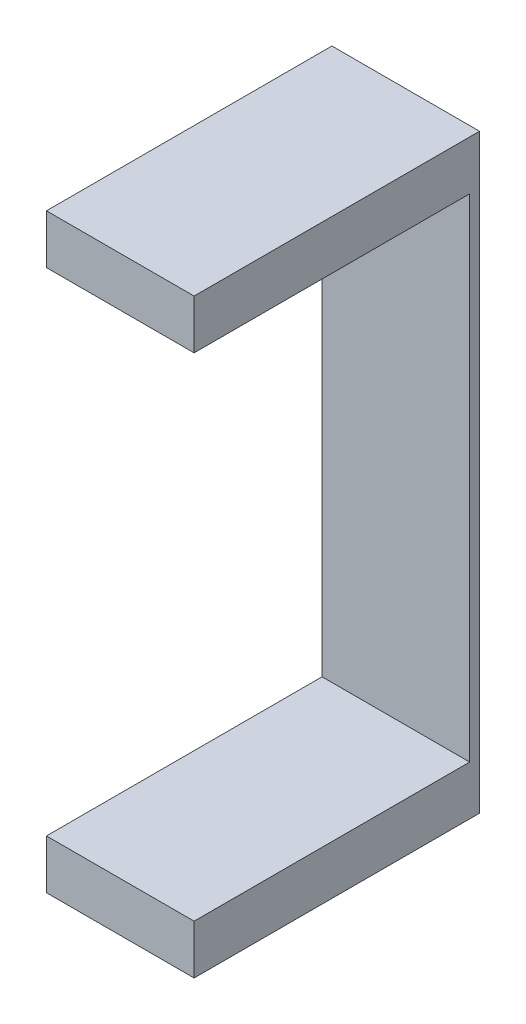
ISO-10303-21;
HEADER;
FILE_DESCRIPTION(('STEP AP214'),'2;1');
FILE_NAME('part.step','',(''),(''),'','','');
FILE_SCHEMA(('AUTOMOTIVE_DESIGN { 1 0 10303 214 1 1 1 1 }'));
ENDSEC;
DATA;
#1=APPLICATION_CONTEXT('core data for automotive mechanical design processes');
#2=APPLICATION_PROTOCOL_DEFINITION('international standard','automotive_design',2000,#1);
#3=PRODUCT_CONTEXT('',#1,'mechanical');
#4=PRODUCT('Part','Part','',(#3));
#5=PRODUCT_RELATED_PRODUCT_CATEGORY('part','',(#4));
#6=PRODUCT_DEFINITION_FORMATION('','',#4);
#7=PRODUCT_DEFINITION_CONTEXT('part definition',#1,'design');
#8=PRODUCT_DEFINITION('design','',#6,#7);
#9=PRODUCT_DEFINITION_SHAPE('','',#8);
#10=(LENGTH_UNIT() NAMED_UNIT(*) SI_UNIT(.MILLI.,.METRE.));
#11=(NAMED_UNIT(*) PLANE_ANGLE_UNIT() SI_UNIT($,.RADIAN.));
#12=(NAMED_UNIT(*) SI_UNIT($,.STERADIAN.) SOLID_ANGLE_UNIT());
#13=UNCERTAINTY_MEASURE_WITH_UNIT(LENGTH_MEASURE(1.E-05),#10,'distance_accuracy_value','');
#14=(GEOMETRIC_REPRESENTATION_CONTEXT(3) GLOBAL_UNCERTAINTY_ASSIGNED_CONTEXT((#13)) GLOBAL_UNIT_ASSIGNED_CONTEXT((#10,
#11,#12)) REPRESENTATION_CONTEXT('',''));
#15=CARTESIAN_POINT('',(0.,0.,0.));
#16=DIRECTION('',(0.,0.,1.));
#17=DIRECTION('',(1.,0.,0.));
#18=AXIS2_PLACEMENT_3D('',#15,#16,#17);
#19=CARTESIAN_POINT('',(-15.,60.,2.));
#20=DIRECTION('',(0.,-1.,0.));
#21=DIRECTION('',(0.,0.,-1.));
#22=AXIS2_PLACEMENT_3D('',#19,#20,#21);
#23=PLANE('',#22);
#24=DIRECTION('',(-1.,0.,0.));
#25=VECTOR('',#24,1.);
#26=CARTESIAN_POINT('',(-15.,60.,0.));
#27=LINE('',#26,#25);
#28=CARTESIAN_POINT('',(15.,60.,0.));
#29=VERTEX_POINT('',#28);
#30=CARTESIAN_POINT('',(-15.,60.,0.));
#31=VERTEX_POINT('',#30);
#32=EDGE_CURVE('E125',#29,#31,#27,.T.);
#33=ORIENTED_EDGE('',*,*,#32,.T.);
#34=DIRECTION('',(0.,0.,-1.));
#35=VECTOR('',#34,1.);
#36=CARTESIAN_POINT('',(-15.,60.,2.));
#37=LINE('',#36,#35);
#38=CARTESIAN_POINT('',(-15.,60.,58.));
#39=VERTEX_POINT('',#38);
#40=EDGE_CURVE('E11',#39,#31,#37,.T.);
#41=ORIENTED_EDGE('',*,*,#40,.F.);
#42=DIRECTION('',(-1.,0.,0.));
#43=VECTOR('',#42,1.);
#44=CARTESIAN_POINT('',(-15.,60.,58.));
#45=LINE('',#44,#43);
#46=CARTESIAN_POINT('',(15.,60.,58.));
#47=VERTEX_POINT('',#46);
#48=EDGE_CURVE('E119',#47,#39,#45,.T.);
#49=ORIENTED_EDGE('',*,*,#48,.F.);
#50=DIRECTION('',(0.,0.,-1.));
#51=VECTOR('',#50,1.);
#52=CARTESIAN_POINT('',(15.,60.,2.));
#53=LINE('',#52,#51);
#54=EDGE_CURVE('E152',#47,#29,#53,.T.);
#55=ORIENTED_EDGE('',*,*,#54,.T.);
#56=EDGE_LOOP('',(#33,#41,#49,#55));
#57=FACE_BOUND('',#56,.T.);
#58=ADVANCED_FACE('F39',(#57),#23,.F.);
#59=CARTESIAN_POINT('',(-15.,-60.,2.));
#60=DIRECTION('',(1.,0.,0.));
#61=DIRECTION('',(0.,0.,-1.));
#62=AXIS2_PLACEMENT_3D('',#59,#60,#61);
#63=PLANE('',#62);
#64=DIRECTION('',(0.,-1.,0.));
#65=VECTOR('',#64,1.);
#66=CARTESIAN_POINT('',(-15.,-60.,0.));
#67=LINE('',#66,#65);
#68=CARTESIAN_POINT('',(-15.,-60.,0.));
#69=VERTEX_POINT('',#68);
#70=EDGE_CURVE('E128',#31,#69,#67,.T.);
#71=ORIENTED_EDGE('',*,*,#70,.T.);
#72=DIRECTION('',(0.,0.,-1.));
#73=VECTOR('',#72,1.);
#74=CARTESIAN_POINT('',(-15.,-60.,2.));
#75=LINE('',#74,#73);
#76=CARTESIAN_POINT('',(-15.,-60.,58.));
#77=VERTEX_POINT('',#76);
#78=EDGE_CURVE('E46',#77,#69,#75,.T.);
#79=ORIENTED_EDGE('',*,*,#78,.F.);
#80=DIRECTION('',(0.,-1.,0.));
#81=VECTOR('',#80,1.);
#82=CARTESIAN_POINT('',(-15.,-60.,58.));
#83=LINE('',#82,#81);
#84=CARTESIAN_POINT('',(-15.,-50.,58.));
#85=VERTEX_POINT('',#84);
#86=EDGE_CURVE('E140',#85,#77,#83,.T.);
#87=ORIENTED_EDGE('',*,*,#86,.F.);
#88=DIRECTION('',(0.,0.,-1.));
#89=VECTOR('',#88,1.);
#90=CARTESIAN_POINT('',(-15.,-50.,58.));
#91=LINE('',#90,#89);
#92=CARTESIAN_POINT('',(-15.,-50.,2.));
#93=VERTEX_POINT('',#92);
#94=EDGE_CURVE('E136',#85,#93,#91,.T.);
#95=ORIENTED_EDGE('',*,*,#94,.T.);
#96=DIRECTION('',(0.,-1.,0.));
#97=VECTOR('',#96,1.);
#98=CARTESIAN_POINT('',(-15.,-60.,2.));
#99=LINE('',#98,#97);
#100=CARTESIAN_POINT('',(-15.,50.,2.));
#101=VERTEX_POINT('',#100);
#102=EDGE_CURVE('E124',#101,#93,#99,.T.);
#103=ORIENTED_EDGE('',*,*,#102,.F.);
#104=DIRECTION('',(0.,0.,-1.));
#105=VECTOR('',#104,1.);
#106=CARTESIAN_POINT('',(-15.,50.,58.));
#107=LINE('',#106,#105);
#108=CARTESIAN_POINT('',(-15.,50.,58.));
#109=VERTEX_POINT('',#108);
#110=EDGE_CURVE('E106',#109,#101,#107,.T.);
#111=ORIENTED_EDGE('',*,*,#110,.F.);
#112=DIRECTION('',(0.,-1.,0.));
#113=VECTOR('',#112,1.);
#114=CARTESIAN_POINT('',(-15.,60.,58.));
#115=LINE('',#114,#113);
#116=EDGE_CURVE('E113',#39,#109,#115,.T.);
#117=ORIENTED_EDGE('',*,*,#116,.F.);
#118=ORIENTED_EDGE('',*,*,#40,.T.);
#119=EDGE_LOOP('',(#71,#79,#87,#95,#103,#111,#117,#118));
#120=FACE_BOUND('',#119,.T.);
#121=ADVANCED_FACE('F122',(#120),#63,.F.);
#122=CARTESIAN_POINT('',(-15.,-60.,2.));
#123=DIRECTION('',(0.,1.,0.));
#124=DIRECTION('',(-1.,0.,0.));
#125=AXIS2_PLACEMENT_3D('',#122,#123,#124);
#126=PLANE('',#125);
#127=DIRECTION('',(1.,0.,0.));
#128=VECTOR('',#127,1.);
#129=CARTESIAN_POINT('',(-15.,-60.,0.));
#130=LINE('',#129,#128);
#131=CARTESIAN_POINT('',(15.,-60.,0.));
#132=VERTEX_POINT('',#131);
#133=EDGE_CURVE('E155',#69,#132,#130,.T.);
#134=ORIENTED_EDGE('',*,*,#133,.T.);
#135=DIRECTION('',(0.,0.,-1.));
#136=VECTOR('',#135,1.);
#137=CARTESIAN_POINT('',(15.,-60.,2.));
#138=LINE('',#137,#136);
#139=CARTESIAN_POINT('',(15.,-60.,58.));
#140=VERTEX_POINT('',#139);
#141=EDGE_CURVE('E160',#140,#132,#138,.T.);
#142=ORIENTED_EDGE('',*,*,#141,.F.);
#143=DIRECTION('',(1.,0.,0.));
#144=VECTOR('',#143,1.);
#145=CARTESIAN_POINT('',(-15.,-60.,58.));
#146=LINE('',#145,#144);
#147=EDGE_CURVE('E144',#77,#140,#146,.T.);
#148=ORIENTED_EDGE('',*,*,#147,.F.);
#149=ORIENTED_EDGE('',*,*,#78,.T.);
#150=EDGE_LOOP('',(#134,#142,#148,#149));
#151=FACE_BOUND('',#150,.T.);
#152=ADVANCED_FACE('F166',(#151),#126,.F.);
#153=CARTESIAN_POINT('',(15.,-60.,2.));
#154=DIRECTION('',(-1.,0.,0.));
#155=DIRECTION('',(0.,0.,1.));
#156=AXIS2_PLACEMENT_3D('',#153,#154,#155);
#157=PLANE('',#156);
#158=DIRECTION('',(0.,1.,0.));
#159=VECTOR('',#158,1.);
#160=CARTESIAN_POINT('',(15.,-60.,0.));
#161=LINE('',#160,#159);
#162=EDGE_CURVE('E151',#132,#29,#161,.T.);
#163=ORIENTED_EDGE('',*,*,#162,.T.);
#164=ORIENTED_EDGE('',*,*,#54,.F.);
#165=DIRECTION('',(0.,1.,0.));
#166=VECTOR('',#165,1.);
#167=CARTESIAN_POINT('',(15.,60.,58.));
#168=LINE('',#167,#166);
#169=CARTESIAN_POINT('',(15.,50.,58.));
#170=VERTEX_POINT('',#169);
#171=EDGE_CURVE('E112',#170,#47,#168,.T.);
#172=ORIENTED_EDGE('',*,*,#171,.F.);
#173=DIRECTION('',(0.,0.,-1.));
#174=VECTOR('',#173,1.);
#175=CARTESIAN_POINT('',(15.,50.,58.));
#176=LINE('',#175,#174);
#177=CARTESIAN_POINT('',(15.,50.,2.));
#178=VERTEX_POINT('',#177);
#179=EDGE_CURVE('E108',#170,#178,#176,.T.);
#180=ORIENTED_EDGE('',*,*,#179,.T.);
#181=DIRECTION('',(0.,1.,0.));
#182=VECTOR('',#181,1.);
#183=CARTESIAN_POINT('',(15.,-60.,2.));
#184=LINE('',#183,#182);
#185=CARTESIAN_POINT('',(15.,-50.,2.));
#186=VERTEX_POINT('',#185);
#187=EDGE_CURVE('E150',#186,#178,#184,.T.);
#188=ORIENTED_EDGE('',*,*,#187,.F.);
#189=DIRECTION('',(0.,0.,-1.));
#190=VECTOR('',#189,1.);
#191=CARTESIAN_POINT('',(15.,-50.,58.));
#192=LINE('',#191,#190);
#193=CARTESIAN_POINT('',(15.,-50.,58.));
#194=VERTEX_POINT('',#193);
#195=EDGE_CURVE('E133',#194,#186,#192,.T.);
#196=ORIENTED_EDGE('',*,*,#195,.F.);
#197=DIRECTION('',(0.,1.,0.));
#198=VECTOR('',#197,1.);
#199=CARTESIAN_POINT('',(15.,-60.,58.));
#200=LINE('',#199,#198);
#201=EDGE_CURVE('E142',#140,#194,#200,.T.);
#202=ORIENTED_EDGE('',*,*,#201,.F.);
#203=ORIENTED_EDGE('',*,*,#141,.T.);
#204=EDGE_LOOP('',(#163,#164,#172,#180,#188,#196,#202,#203));
#205=FACE_BOUND('',#204,.T.);
#206=ADVANCED_FACE('F173',(#205),#157,.F.);
#207=CARTESIAN_POINT('',(0.,0.,2.));
#208=DIRECTION('',(0.,0.,1.));
#209=DIRECTION('',(1.,0.,0.));
#210=AXIS2_PLACEMENT_3D('',#207,#208,#209);
#211=PLANE('',#210);
#212=DIRECTION('',(1.,0.,0.));
#213=VECTOR('',#212,1.);
#214=CARTESIAN_POINT('',(-15.,50.,2.));
#215=LINE('',#214,#213);
#216=EDGE_CURVE('E58',#101,#178,#215,.T.);
#217=ORIENTED_EDGE('',*,*,#216,.F.);
#218=ORIENTED_EDGE('',*,*,#102,.T.);
#219=DIRECTION('',(-1.,0.,0.));
#220=VECTOR('',#219,1.);
#221=CARTESIAN_POINT('',(-15.,-50.,2.));
#222=LINE('',#221,#220);
#223=EDGE_CURVE('E53',#186,#93,#222,.T.);
#224=ORIENTED_EDGE('',*,*,#223,.F.);
#225=ORIENTED_EDGE('',*,*,#187,.T.);
#226=EDGE_LOOP('',(#217,#218,#224,#225));
#227=FACE_BOUND('',#226,.T.);
#228=ADVANCED_FACE('F206',(#227),#211,.T.);
#229=CARTESIAN_POINT('',(0.,0.,0.));
#230=DIRECTION('',(0.,0.,1.));
#231=DIRECTION('',(1.,0.,0.));
#232=AXIS2_PLACEMENT_3D('',#229,#230,#231);
#233=PLANE('',#232);
#234=ORIENTED_EDGE('',*,*,#32,.F.);
#235=ORIENTED_EDGE('',*,*,#162,.F.);
#236=ORIENTED_EDGE('',*,*,#133,.F.);
#237=ORIENTED_EDGE('',*,*,#70,.F.);
#238=EDGE_LOOP('',(#234,#235,#236,#237));
#239=FACE_BOUND('',#238,.T.);
#240=ADVANCED_FACE('F171',(#239),#233,.F.);
#241=CARTESIAN_POINT('',(-15.,-50.,58.));
#242=DIRECTION('',(0.,-1.,0.));
#243=DIRECTION('',(0.,0.,-1.));
#244=AXIS2_PLACEMENT_3D('',#241,#242,#243);
#245=PLANE('',#244);
#246=ORIENTED_EDGE('',*,*,#223,.T.);
#247=ORIENTED_EDGE('',*,*,#94,.F.);
#248=DIRECTION('',(-1.,0.,0.));
#249=VECTOR('',#248,1.);
#250=CARTESIAN_POINT('',(-15.,-50.,58.));
#251=LINE('',#250,#249);
#252=EDGE_CURVE('E138',#194,#85,#251,.T.);
#253=ORIENTED_EDGE('',*,*,#252,.F.);
#254=ORIENTED_EDGE('',*,*,#195,.T.);
#255=EDGE_LOOP('',(#246,#247,#253,#254));
#256=FACE_BOUND('',#255,.T.);
#257=ADVANCED_FACE('F181',(#256),#245,.F.);
#258=CARTESIAN_POINT('',(0.,0.,58.));
#259=DIRECTION('',(0.,0.,-1.));
#260=DIRECTION('',(-1.,0.,0.));
#261=AXIS2_PLACEMENT_3D('',#258,#259,#260);
#262=PLANE('',#261);
#263=ORIENTED_EDGE('',*,*,#86,.T.);
#264=ORIENTED_EDGE('',*,*,#147,.T.);
#265=ORIENTED_EDGE('',*,*,#201,.T.);
#266=ORIENTED_EDGE('',*,*,#252,.T.);
#267=EDGE_LOOP('',(#263,#264,#265,#266));
#268=FACE_BOUND('',#267,.T.);
#269=ADVANCED_FACE('F184',(#268),#262,.F.);
#270=CARTESIAN_POINT('',(-15.,50.,58.));
#271=DIRECTION('',(0.,1.,0.));
#272=DIRECTION('',(0.,0.,1.));
#273=AXIS2_PLACEMENT_3D('',#270,#271,#272);
#274=PLANE('',#273);
#275=ORIENTED_EDGE('',*,*,#216,.T.);
#276=ORIENTED_EDGE('',*,*,#179,.F.);
#277=DIRECTION('',(1.,0.,0.));
#278=VECTOR('',#277,1.);
#279=CARTESIAN_POINT('',(-15.,50.,58.));
#280=LINE('',#279,#278);
#281=EDGE_CURVE('E102',#109,#170,#280,.T.);
#282=ORIENTED_EDGE('',*,*,#281,.F.);
#283=ORIENTED_EDGE('',*,*,#110,.T.);
#284=EDGE_LOOP('',(#275,#276,#282,#283));
#285=FACE_BOUND('',#284,.T.);
#286=ADVANCED_FACE('F104',(#285),#274,.F.);
#287=CARTESIAN_POINT('',(0.,0.,58.));
#288=DIRECTION('',(0.,0.,1.));
#289=DIRECTION('',(1.,0.,0.));
#290=AXIS2_PLACEMENT_3D('',#287,#288,#289);
#291=PLANE('',#290);
#292=ORIENTED_EDGE('',*,*,#116,.T.);
#293=ORIENTED_EDGE('',*,*,#281,.T.);
#294=ORIENTED_EDGE('',*,*,#171,.T.);
#295=ORIENTED_EDGE('',*,*,#48,.T.);
#296=EDGE_LOOP('',(#292,#293,#294,#295));
#297=FACE_BOUND('',#296,.T.);
#298=ADVANCED_FACE('F117',(#297),#291,.T.);
#299=CLOSED_SHELL('',(#58,#121,#152,#206,#228,#240,#257,#269,#286,#298));
#300=MANIFOLD_SOLID_BREP('B2',#299);
#301=ADVANCED_BREP_SHAPE_REPRESENTATION('',(#18,#300),#14);
#302=SHAPE_DEFINITION_REPRESENTATION(#9,#301);
ENDSEC;
END-ISO-10303-21;
